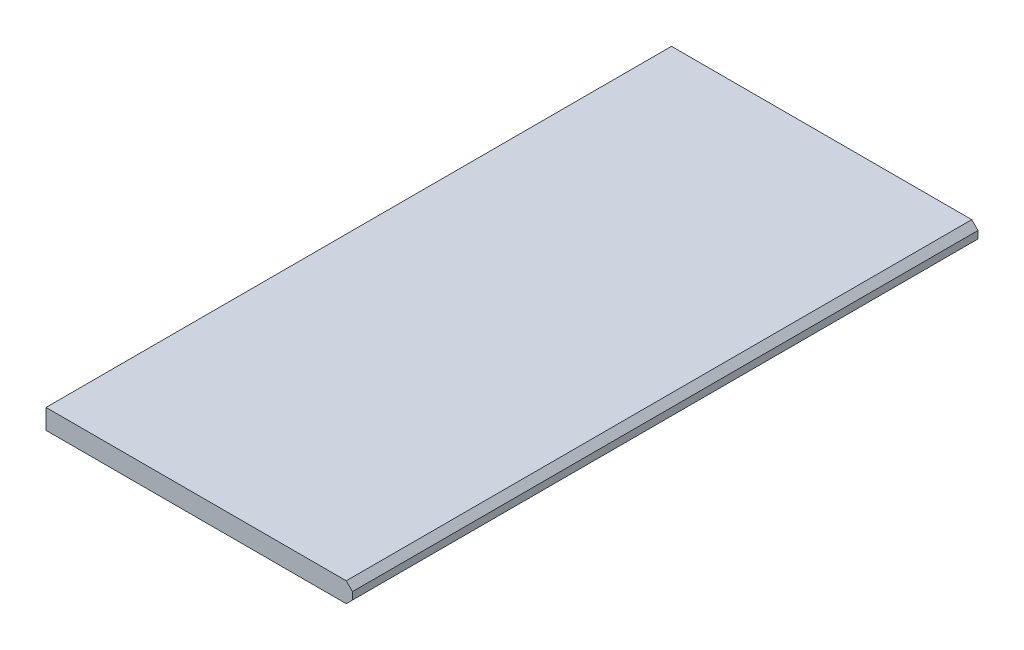
ISO-10303-21;
HEADER;
FILE_DESCRIPTION(('STEP AP214'),'2;1');
FILE_NAME('part.step','',(''),(''),'','','');
FILE_SCHEMA(('AUTOMOTIVE_DESIGN { 1 0 10303 214 1 1 1 1 }'));
ENDSEC;
DATA;
#1=APPLICATION_CONTEXT('core data for automotive mechanical design processes');
#2=APPLICATION_PROTOCOL_DEFINITION('international standard','automotive_design',2000,#1);
#3=PRODUCT_CONTEXT('',#1,'mechanical');
#4=PRODUCT('Part','Part','',(#3));
#5=PRODUCT_RELATED_PRODUCT_CATEGORY('part','',(#4));
#6=PRODUCT_DEFINITION_FORMATION('','',#4);
#7=PRODUCT_DEFINITION_CONTEXT('part definition',#1,'design');
#8=PRODUCT_DEFINITION('design','',#6,#7);
#9=PRODUCT_DEFINITION_SHAPE('','',#8);
#10=(LENGTH_UNIT() NAMED_UNIT(*) SI_UNIT(.MILLI.,.METRE.));
#11=(NAMED_UNIT(*) PLANE_ANGLE_UNIT() SI_UNIT($,.RADIAN.));
#12=(NAMED_UNIT(*) SI_UNIT($,.STERADIAN.) SOLID_ANGLE_UNIT());
#13=UNCERTAINTY_MEASURE_WITH_UNIT(LENGTH_MEASURE(1.E-05),#10,'distance_accuracy_value','');
#14=(GEOMETRIC_REPRESENTATION_CONTEXT(3) GLOBAL_UNCERTAINTY_ASSIGNED_CONTEXT((#13)) GLOBAL_UNIT_ASSIGNED_CONTEXT((#10,
#11,#12)) REPRESENTATION_CONTEXT('',''));
#15=CARTESIAN_POINT('',(0.,0.,0.));
#16=DIRECTION('',(0.,0.,1.));
#17=DIRECTION('',(1.,0.,0.));
#18=AXIS2_PLACEMENT_3D('',#15,#16,#17);
#19=CARTESIAN_POINT('',(12.25,0.79375,50.));
#20=DIRECTION('',(-1.,0.,0.));
#21=DIRECTION('',(0.,0.,1.));
#22=AXIS2_PLACEMENT_3D('',#19,#20,#21);
#23=PLANE('',#22);
#24=DIRECTION('',(0.,1.,0.));
#25=VECTOR('',#24,1.);
#26=CARTESIAN_POINT('',(12.25,0.79375,50.));
#27=LINE('',#26,#25);
#28=CARTESIAN_POINT('',(12.25,-0.293749999999993,50.));
#29=VERTEX_POINT('',#28);
#30=CARTESIAN_POINT('',(12.25,0.293749999999986,50.));
#31=VERTEX_POINT('',#30);
#32=EDGE_CURVE('E103',#29,#31,#27,.T.);
#33=ORIENTED_EDGE('',*,*,#32,.F.);
#34=DIRECTION('',(0.,0.,-1.));
#35=VECTOR('',#34,1.);
#36=CARTESIAN_POINT('',(12.25,-0.293749999999993,50.));
#37=LINE('',#36,#35);
#38=CARTESIAN_POINT('',(12.25,-0.293749999999993,0.));
#39=VERTEX_POINT('',#38);
#40=EDGE_CURVE('E132',#29,#39,#37,.T.);
#41=ORIENTED_EDGE('',*,*,#40,.T.);
#42=DIRECTION('',(0.,1.,0.));
#43=VECTOR('',#42,1.);
#44=CARTESIAN_POINT('',(12.25,0.79375,0.));
#45=LINE('',#44,#43);
#46=CARTESIAN_POINT('',(12.25,0.293749999999986,0.));
#47=VERTEX_POINT('',#46);
#48=EDGE_CURVE('E122',#39,#47,#45,.T.);
#49=ORIENTED_EDGE('',*,*,#48,.T.);
#50=DIRECTION('',(0.,0.,1.));
#51=VECTOR('',#50,1.);
#52=CARTESIAN_POINT('',(12.25,0.293749999999986,50.));
#53=LINE('',#52,#51);
#54=EDGE_CURVE('E112',#47,#31,#53,.T.);
#55=ORIENTED_EDGE('',*,*,#54,.T.);
#56=EDGE_LOOP('',(#33,#41,#49,#55));
#57=FACE_BOUND('',#56,.T.);
#58=ADVANCED_FACE('F41',(#57),#23,.F.);
#59=CARTESIAN_POINT('',(-12.25,0.79375,50.));
#60=DIRECTION('',(0.,-1.,0.));
#61=DIRECTION('',(0.,0.,-1.));
#62=AXIS2_PLACEMENT_3D('',#59,#60,#61);
#63=PLANE('',#62);
#64=DIRECTION('',(-1.,0.,0.));
#65=VECTOR('',#64,1.);
#66=CARTESIAN_POINT('',(-12.25,0.79375,50.));
#67=LINE('',#66,#65);
#68=CARTESIAN_POINT('',(11.75,0.79375,50.));
#69=VERTEX_POINT('',#68);
#70=CARTESIAN_POINT('',(-12.25,0.79375,50.));
#71=VERTEX_POINT('',#70);
#72=EDGE_CURVE('E95',#69,#71,#67,.T.);
#73=ORIENTED_EDGE('',*,*,#72,.F.);
#74=DIRECTION('',(0.,0.,-1.));
#75=VECTOR('',#74,1.);
#76=CARTESIAN_POINT('',(11.75,0.79375,50.));
#77=LINE('',#76,#75);
#78=CARTESIAN_POINT('',(11.75,0.79375,0.));
#79=VERTEX_POINT('',#78);
#80=EDGE_CURVE('E11',#69,#79,#77,.T.);
#81=ORIENTED_EDGE('',*,*,#80,.T.);
#82=DIRECTION('',(-1.,0.,0.));
#83=VECTOR('',#82,1.);
#84=CARTESIAN_POINT('',(-12.25,0.79375,0.));
#85=LINE('',#84,#83);
#86=CARTESIAN_POINT('',(-12.25,0.79375,0.));
#87=VERTEX_POINT('',#86);
#88=EDGE_CURVE('E109',#79,#87,#85,.T.);
#89=ORIENTED_EDGE('',*,*,#88,.T.);
#90=DIRECTION('',(0.,0.,-1.));
#91=VECTOR('',#90,1.);
#92=CARTESIAN_POINT('',(-12.25,0.79375,50.));
#93=LINE('',#92,#91);
#94=EDGE_CURVE('E106',#71,#87,#93,.T.);
#95=ORIENTED_EDGE('',*,*,#94,.F.);
#96=EDGE_LOOP('',(#73,#81,#89,#95));
#97=FACE_BOUND('',#96,.T.);
#98=ADVANCED_FACE('F107',(#97),#63,.F.);
#99=CARTESIAN_POINT('',(-12.25,0.79375,50.));
#100=DIRECTION('',(1.,0.,0.));
#101=DIRECTION('',(0.,0.,-1.));
#102=AXIS2_PLACEMENT_3D('',#99,#100,#101);
#103=PLANE('',#102);
#104=DIRECTION('',(0.,-1.,0.));
#105=VECTOR('',#104,1.);
#106=CARTESIAN_POINT('',(-12.25,0.79375,0.));
#107=LINE('',#106,#105);
#108=CARTESIAN_POINT('',(-12.25,-0.79375,0.));
#109=VERTEX_POINT('',#108);
#110=EDGE_CURVE('E126',#87,#109,#107,.T.);
#111=ORIENTED_EDGE('',*,*,#110,.T.);
#112=DIRECTION('',(0.,0.,-1.));
#113=VECTOR('',#112,1.);
#114=CARTESIAN_POINT('',(-12.25,-0.79375,50.));
#115=LINE('',#114,#113);
#116=CARTESIAN_POINT('',(-12.25,-0.79375,50.));
#117=VERTEX_POINT('',#116);
#118=EDGE_CURVE('E113',#117,#109,#115,.T.);
#119=ORIENTED_EDGE('',*,*,#118,.F.);
#120=DIRECTION('',(0.,-1.,0.));
#121=VECTOR('',#120,1.);
#122=CARTESIAN_POINT('',(-12.25,0.79375,50.));
#123=LINE('',#122,#121);
#124=EDGE_CURVE('E99',#71,#117,#123,.T.);
#125=ORIENTED_EDGE('',*,*,#124,.F.);
#126=ORIENTED_EDGE('',*,*,#94,.T.);
#127=EDGE_LOOP('',(#111,#119,#125,#126));
#128=FACE_BOUND('',#127,.T.);
#129=ADVANCED_FACE('F115',(#128),#103,.F.);
#130=CARTESIAN_POINT('',(-12.25,-0.79375,50.));
#131=DIRECTION('',(0.,1.,0.));
#132=DIRECTION('',(0.,0.,1.));
#133=AXIS2_PLACEMENT_3D('',#130,#131,#132);
#134=PLANE('',#133);
#135=DIRECTION('',(1.,0.,0.));
#136=VECTOR('',#135,1.);
#137=CARTESIAN_POINT('',(-12.25,-0.79375,0.));
#138=LINE('',#137,#136);
#139=CARTESIAN_POINT('',(11.75,-0.79375,0.));
#140=VERTEX_POINT('',#139);
#141=EDGE_CURVE('E128',#109,#140,#138,.T.);
#142=ORIENTED_EDGE('',*,*,#141,.T.);
#143=DIRECTION('',(0.,0.,1.));
#144=VECTOR('',#143,1.);
#145=CARTESIAN_POINT('',(11.75,-0.79375,50.));
#146=LINE('',#145,#144);
#147=CARTESIAN_POINT('',(11.75,-0.79375,50.));
#148=VERTEX_POINT('',#147);
#149=EDGE_CURVE('E65',#140,#148,#146,.T.);
#150=ORIENTED_EDGE('',*,*,#149,.T.);
#151=DIRECTION('',(1.,0.,0.));
#152=VECTOR('',#151,1.);
#153=CARTESIAN_POINT('',(-12.25,-0.79375,50.));
#154=LINE('',#153,#152);
#155=EDGE_CURVE('E117',#117,#148,#154,.T.);
#156=ORIENTED_EDGE('',*,*,#155,.F.);
#157=ORIENTED_EDGE('',*,*,#118,.T.);
#158=EDGE_LOOP('',(#142,#150,#156,#157));
#159=FACE_BOUND('',#158,.T.);
#160=ADVANCED_FACE('F151',(#159),#134,.F.);
#161=CARTESIAN_POINT('',(0.,0.,50.));
#162=DIRECTION('',(0.,0.,1.));
#163=DIRECTION('',(1.,0.,0.));
#164=AXIS2_PLACEMENT_3D('',#161,#162,#163);
#165=PLANE('',#164);
#166=ORIENTED_EDGE('',*,*,#155,.T.);
#167=DIRECTION('',(-0.707106781186554,-0.707106781186541,0.));
#168=VECTOR('',#167,1.);
#169=CARTESIAN_POINT('',(6.27187499999989,-6.271875,50.));
#170=LINE('',#169,#168);
#171=EDGE_CURVE('E50',#148,#29,#170,.F.);
#172=ORIENTED_EDGE('',*,*,#171,.T.);
#173=ORIENTED_EDGE('',*,*,#32,.T.);
#174=DIRECTION('',(0.707106781186544,-0.707106781186551,0.));
#175=VECTOR('',#174,1.);
#176=CARTESIAN_POINT('',(6.27187500000006,6.27187499999999,50.));
#177=LINE('',#176,#175);
#178=EDGE_CURVE('E57',#31,#69,#177,.F.);
#179=ORIENTED_EDGE('',*,*,#178,.T.);
#180=ORIENTED_EDGE('',*,*,#72,.T.);
#181=ORIENTED_EDGE('',*,*,#124,.T.);
#182=EDGE_LOOP('',(#166,#172,#173,#179,#180,#181));
#183=FACE_BOUND('',#182,.T.);
#184=ADVANCED_FACE('F97',(#183),#165,.T.);
#185=CARTESIAN_POINT('',(0.,0.,0.));
#186=DIRECTION('',(0.,0.,1.));
#187=DIRECTION('',(1.,0.,0.));
#188=AXIS2_PLACEMENT_3D('',#185,#186,#187);
#189=PLANE('',#188);
#190=ORIENTED_EDGE('',*,*,#48,.F.);
#191=DIRECTION('',(0.707106781186554,0.707106781186541,0.));
#192=VECTOR('',#191,1.);
#193=CARTESIAN_POINT('',(12.25,-0.293749999999993,0.));
#194=LINE('',#193,#192);
#195=EDGE_CURVE('E137',#39,#140,#194,.F.);
#196=ORIENTED_EDGE('',*,*,#195,.T.);
#197=ORIENTED_EDGE('',*,*,#141,.F.);
#198=ORIENTED_EDGE('',*,*,#110,.F.);
#199=ORIENTED_EDGE('',*,*,#88,.F.);
#200=DIRECTION('',(-0.707106781186544,0.707106781186551,0.));
#201=VECTOR('',#200,1.);
#202=CARTESIAN_POINT('',(11.75,0.79375,0.));
#203=LINE('',#202,#201);
#204=EDGE_CURVE('E135',#79,#47,#203,.F.);
#205=ORIENTED_EDGE('',*,*,#204,.T.);
#206=EDGE_LOOP('',(#190,#196,#197,#198,#199,#205));
#207=FACE_BOUND('',#206,.T.);
#208=ADVANCED_FACE('F150',(#207),#189,.F.);
#209=CARTESIAN_POINT('',(12.25,-0.293749999999993,50.));
#210=DIRECTION('',(-0.707106781186541,0.707106781186554,0.));
#211=DIRECTION('',(0.,0.,-1.));
#212=AXIS2_PLACEMENT_3D('',#209,#210,#211);
#213=PLANE('',#212);
#214=ORIENTED_EDGE('',*,*,#171,.F.);
#215=ORIENTED_EDGE('',*,*,#149,.F.);
#216=ORIENTED_EDGE('',*,*,#195,.F.);
#217=ORIENTED_EDGE('',*,*,#40,.F.);
#218=EDGE_LOOP('',(#214,#215,#216,#217));
#219=FACE_BOUND('',#218,.T.);
#220=ADVANCED_FACE('F147',(#219),#213,.F.);
#221=CARTESIAN_POINT('',(11.75,0.79375,50.));
#222=DIRECTION('',(-0.707106781186551,-0.707106781186544,0.));
#223=DIRECTION('',(0.,0.,-1.));
#224=AXIS2_PLACEMENT_3D('',#221,#222,#223);
#225=PLANE('',#224);
#226=ORIENTED_EDGE('',*,*,#178,.F.);
#227=ORIENTED_EDGE('',*,*,#54,.F.);
#228=ORIENTED_EDGE('',*,*,#204,.F.);
#229=ORIENTED_EDGE('',*,*,#80,.F.);
#230=EDGE_LOOP('',(#226,#227,#228,#229));
#231=FACE_BOUND('',#230,.T.);
#232=ADVANCED_FACE('F44',(#231),#225,.F.);
#233=CLOSED_SHELL('',(#58,#98,#129,#160,#184,#208,#220,#232));
#234=MANIFOLD_SOLID_BREP('B2',#233);
#235=ADVANCED_BREP_SHAPE_REPRESENTATION('',(#18,#234),#14);
#236=SHAPE_DEFINITION_REPRESENTATION(#9,#235);
ENDSEC;
END-ISO-10303-21;
